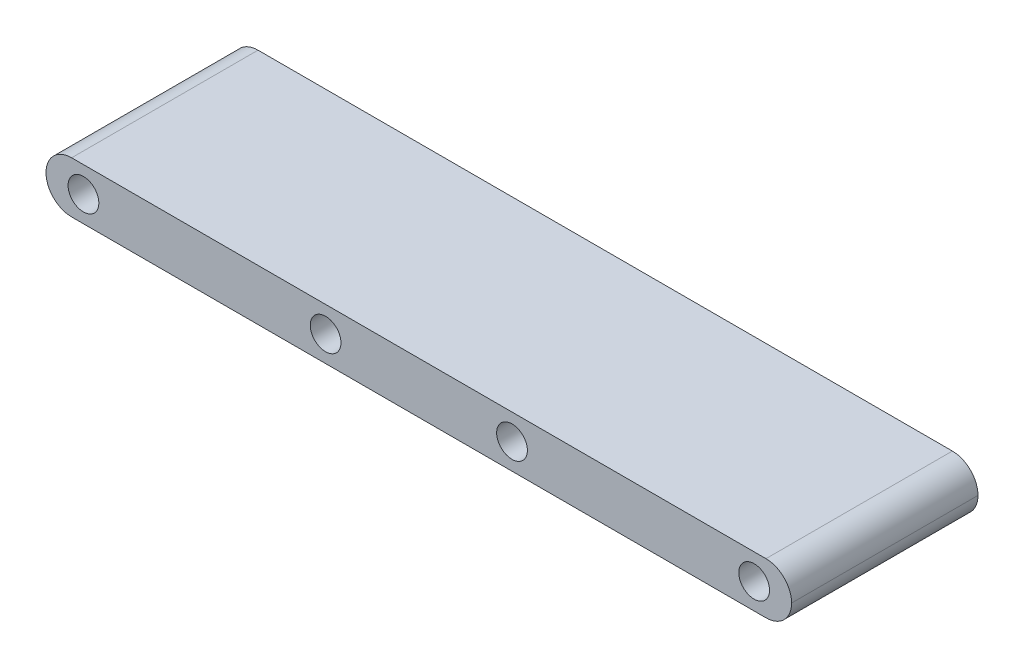
ISO-10303-21;
HEADER;
FILE_DESCRIPTION(('STEP AP214'),'2;1');
FILE_NAME('part.step','',(''),(''),'','','');
FILE_SCHEMA(('AUTOMOTIVE_DESIGN { 1 0 10303 214 1 1 1 1 }'));
ENDSEC;
DATA;
#1=APPLICATION_CONTEXT('core data for automotive mechanical design processes');
#2=APPLICATION_PROTOCOL_DEFINITION('international standard','automotive_design',2000,#1);
#3=PRODUCT_CONTEXT('',#1,'mechanical');
#4=PRODUCT('Part','Part','',(#3));
#5=PRODUCT_RELATED_PRODUCT_CATEGORY('part','',(#4));
#6=PRODUCT_DEFINITION_FORMATION('','',#4);
#7=PRODUCT_DEFINITION_CONTEXT('part definition',#1,'design');
#8=PRODUCT_DEFINITION('design','',#6,#7);
#9=PRODUCT_DEFINITION_SHAPE('','',#8);
#10=(LENGTH_UNIT() NAMED_UNIT(*) SI_UNIT(.MILLI.,.METRE.));
#11=(NAMED_UNIT(*) PLANE_ANGLE_UNIT() SI_UNIT($,.RADIAN.));
#12=(NAMED_UNIT(*) SI_UNIT($,.STERADIAN.) SOLID_ANGLE_UNIT());
#13=UNCERTAINTY_MEASURE_WITH_UNIT(LENGTH_MEASURE(1.E-05),#10,'distance_accuracy_value','');
#14=(GEOMETRIC_REPRESENTATION_CONTEXT(3) GLOBAL_UNCERTAINTY_ASSIGNED_CONTEXT((#13)) GLOBAL_UNIT_ASSIGNED_CONTEXT((#10,
#11,#12)) REPRESENTATION_CONTEXT('',''));
#15=CARTESIAN_POINT('',(0.,0.,0.));
#16=DIRECTION('',(0.,0.,1.));
#17=DIRECTION('',(1.,0.,0.));
#18=AXIS2_PLACEMENT_3D('',#15,#16,#17);
#19=CARTESIAN_POINT('',(0.,0.,200.));
#20=DIRECTION('',(0.,0.,-1.));
#21=DIRECTION('',(-1.,0.,0.));
#22=AXIS2_PLACEMENT_3D('',#19,#20,#21);
#23=PLANE('',#22);
#24=CARTESIAN_POINT('',(759.80762113533,27.5,200.));
#25=DIRECTION('',(0.,0.,1.));
#26=DIRECTION('',(1.,0.,0.));
#27=AXIS2_PLACEMENT_3D('',#24,#25,#26);
#28=CIRCLE('',#27,16.5);
#29=CARTESIAN_POINT('',(776.30762113533,27.5,200.));
#30=VERTEX_POINT('',#29);
#31=EDGE_CURVE('E198',#30,#30,#28,.T.);
#32=ORIENTED_EDGE('',*,*,#31,.F.);
#33=EDGE_LOOP('',(#32));
#34=FACE_BOUND('',#33,.T.);
#35=CARTESIAN_POINT('',(40.1923788646686,27.5,200.));
#36=DIRECTION('',(0.,0.,1.));
#37=DIRECTION('',(1.,0.,0.));
#38=AXIS2_PLACEMENT_3D('',#35,#36,#37);
#39=CIRCLE('',#38,16.5);
#40=CARTESIAN_POINT('',(56.6923788646686,27.5,200.));
#41=VERTEX_POINT('',#40);
#42=EDGE_CURVE('E161',#41,#41,#39,.T.);
#43=ORIENTED_EDGE('',*,*,#42,.F.);
#44=EDGE_LOOP('',(#43));
#45=FACE_BOUND('',#44,.T.);
#46=CARTESIAN_POINT('',(27.5,27.5,200.));
#47=DIRECTION('',(0.,0.,-1.));
#48=DIRECTION('',(-1.,0.,0.));
#49=AXIS2_PLACEMENT_3D('',#46,#47,#48);
#50=CIRCLE('',#49,27.5);
#51=CARTESIAN_POINT('',(27.5,55.,200.));
#52=VERTEX_POINT('',#51);
#53=CARTESIAN_POINT('',(0.,27.5,200.));
#54=VERTEX_POINT('',#53);
#55=EDGE_CURVE('E153',#52,#54,#50,.F.);
#56=ORIENTED_EDGE('',*,*,#55,.T.);
#57=CARTESIAN_POINT('',(27.5,27.5,200.));
#58=DIRECTION('',(0.,0.,-1.));
#59=DIRECTION('',(-1.,0.,0.));
#60=AXIS2_PLACEMENT_3D('',#57,#58,#59);
#61=CIRCLE('',#60,27.5);
#62=CARTESIAN_POINT('',(27.5,0.,200.));
#63=VERTEX_POINT('',#62);
#64=EDGE_CURVE('E156',#54,#63,#61,.F.);
#65=ORIENTED_EDGE('',*,*,#64,.T.);
#66=DIRECTION('',(1.,0.,0.));
#67=VECTOR('',#66,1.);
#68=CARTESIAN_POINT('',(0.,0.,200.));
#69=LINE('',#68,#67);
#70=CARTESIAN_POINT('',(772.5,0.,200.));
#71=VERTEX_POINT('',#70);
#72=EDGE_CURVE('E117',#63,#71,#69,.T.);
#73=ORIENTED_EDGE('',*,*,#72,.T.);
#74=CARTESIAN_POINT('',(772.5,27.5,200.));
#75=DIRECTION('',(0.,0.,-1.));
#76=DIRECTION('',(-1.,0.,0.));
#77=AXIS2_PLACEMENT_3D('',#74,#75,#76);
#78=CIRCLE('',#77,27.5);
#79=CARTESIAN_POINT('',(800.,27.5,200.));
#80=VERTEX_POINT('',#79);
#81=EDGE_CURVE('E150',#71,#80,#78,.F.);
#82=ORIENTED_EDGE('',*,*,#81,.T.);
#83=CARTESIAN_POINT('',(772.5,27.5,200.));
#84=DIRECTION('',(0.,0.,-1.));
#85=DIRECTION('',(-1.,0.,0.));
#86=AXIS2_PLACEMENT_3D('',#83,#84,#85);
#87=CIRCLE('',#86,27.5);
#88=CARTESIAN_POINT('',(772.5,55.,200.));
#89=VERTEX_POINT('',#88);
#90=EDGE_CURVE('E64',#80,#89,#87,.F.);
#91=ORIENTED_EDGE('',*,*,#90,.T.);
#92=DIRECTION('',(-1.,0.,0.));
#93=VECTOR('',#92,1.);
#94=CARTESIAN_POINT('',(0.,55.,200.));
#95=LINE('',#94,#93);
#96=EDGE_CURVE('E137',#89,#52,#95,.T.);
#97=ORIENTED_EDGE('',*,*,#96,.T.);
#98=EDGE_LOOP('',(#56,#65,#73,#82,#91,#97));
#99=FACE_BOUND('',#98,.T.);
#100=CARTESIAN_POINT('',(300.,27.5,200.));
#101=DIRECTION('',(0.,0.,1.));
#102=DIRECTION('',(1.,0.,0.));
#103=AXIS2_PLACEMENT_3D('',#100,#101,#102);
#104=CIRCLE('',#103,16.5);
#105=CARTESIAN_POINT('',(316.5,27.5,200.));
#106=VERTEX_POINT('',#105);
#107=EDGE_CURVE('E128',#106,#106,#104,.T.);
#108=ORIENTED_EDGE('',*,*,#107,.F.);
#109=EDGE_LOOP('',(#108));
#110=FACE_BOUND('',#109,.T.);
#111=CARTESIAN_POINT('',(500.,27.5,200.));
#112=DIRECTION('',(0.,0.,1.));
#113=DIRECTION('',(1.,0.,0.));
#114=AXIS2_PLACEMENT_3D('',#111,#112,#113);
#115=CIRCLE('',#114,16.5);
#116=CARTESIAN_POINT('',(516.5,27.5,200.));
#117=VERTEX_POINT('',#116);
#118=EDGE_CURVE('E185',#117,#117,#115,.T.);
#119=ORIENTED_EDGE('',*,*,#118,.F.);
#120=EDGE_LOOP('',(#119));
#121=FACE_BOUND('',#120,.T.);
#122=ADVANCED_FACE('F41',(#34,#45,#99,#110,#121),#23,.F.);
#123=CARTESIAN_POINT('',(0.,0.,0.));
#124=DIRECTION('',(0.,0.,-1.));
#125=DIRECTION('',(-1.,0.,0.));
#126=AXIS2_PLACEMENT_3D('',#123,#124,#125);
#127=PLANE('',#126);
#128=CARTESIAN_POINT('',(759.80762113533,27.5,0.));
#129=DIRECTION('',(0.,0.,1.));
#130=DIRECTION('',(1.,0.,0.));
#131=AXIS2_PLACEMENT_3D('',#128,#129,#130);
#132=CIRCLE('',#131,16.5);
#133=CARTESIAN_POINT('',(776.30762113533,27.5,0.));
#134=VERTEX_POINT('',#133);
#135=EDGE_CURVE('E191',#134,#134,#132,.T.);
#136=ORIENTED_EDGE('',*,*,#135,.T.);
#137=EDGE_LOOP('',(#136));
#138=FACE_BOUND('',#137,.T.);
#139=CARTESIAN_POINT('',(40.1923788646686,27.5,0.));
#140=DIRECTION('',(0.,0.,1.));
#141=DIRECTION('',(1.,0.,0.));
#142=AXIS2_PLACEMENT_3D('',#139,#140,#141);
#143=CIRCLE('',#142,16.5);
#144=CARTESIAN_POINT('',(56.6923788646686,27.5,0.));
#145=VERTEX_POINT('',#144);
#146=EDGE_CURVE('E165',#145,#145,#143,.T.);
#147=ORIENTED_EDGE('',*,*,#146,.T.);
#148=EDGE_LOOP('',(#147));
#149=FACE_BOUND('',#148,.T.);
#150=CARTESIAN_POINT('',(300.,27.5,0.));
#151=DIRECTION('',(0.,0.,1.));
#152=DIRECTION('',(1.,0.,0.));
#153=AXIS2_PLACEMENT_3D('',#150,#151,#152);
#154=CIRCLE('',#153,16.5);
#155=CARTESIAN_POINT('',(316.5,27.5,0.));
#156=VERTEX_POINT('',#155);
#157=EDGE_CURVE('E134',#156,#156,#154,.T.);
#158=ORIENTED_EDGE('',*,*,#157,.T.);
#159=EDGE_LOOP('',(#158));
#160=FACE_BOUND('',#159,.T.);
#161=DIRECTION('',(1.,0.,0.));
#162=VECTOR('',#161,1.);
#163=CARTESIAN_POINT('',(0.,0.,0.));
#164=LINE('',#163,#162);
#165=CARTESIAN_POINT('',(27.5,0.,0.));
#166=VERTEX_POINT('',#165);
#167=CARTESIAN_POINT('',(772.5,0.,0.));
#168=VERTEX_POINT('',#167);
#169=EDGE_CURVE('E114',#166,#168,#164,.T.);
#170=ORIENTED_EDGE('',*,*,#169,.F.);
#171=CARTESIAN_POINT('',(27.5,27.5,0.));
#172=DIRECTION('',(0.,0.,-1.));
#173=DIRECTION('',(-1.,0.,0.));
#174=AXIS2_PLACEMENT_3D('',#171,#172,#173);
#175=CIRCLE('',#174,27.5);
#176=CARTESIAN_POINT('',(0.,27.5,0.));
#177=VERTEX_POINT('',#176);
#178=EDGE_CURVE('E96',#166,#177,#175,.T.);
#179=ORIENTED_EDGE('',*,*,#178,.T.);
#180=CARTESIAN_POINT('',(27.5,27.5,0.));
#181=DIRECTION('',(0.,0.,-1.));
#182=DIRECTION('',(-1.,0.,0.));
#183=AXIS2_PLACEMENT_3D('',#180,#181,#182);
#184=CIRCLE('',#183,27.5);
#185=CARTESIAN_POINT('',(27.5,55.,0.));
#186=VERTEX_POINT('',#185);
#187=EDGE_CURVE('E107',#177,#186,#184,.T.);
#188=ORIENTED_EDGE('',*,*,#187,.T.);
#189=DIRECTION('',(-1.,0.,0.));
#190=VECTOR('',#189,1.);
#191=CARTESIAN_POINT('',(0.,55.,0.));
#192=LINE('',#191,#190);
#193=CARTESIAN_POINT('',(772.5,55.,0.));
#194=VERTEX_POINT('',#193);
#195=EDGE_CURVE('E127',#194,#186,#192,.T.);
#196=ORIENTED_EDGE('',*,*,#195,.F.);
#197=CARTESIAN_POINT('',(772.5,27.5,0.));
#198=DIRECTION('',(0.,0.,-1.));
#199=DIRECTION('',(-1.,0.,0.));
#200=AXIS2_PLACEMENT_3D('',#197,#198,#199);
#201=CIRCLE('',#200,27.5);
#202=CARTESIAN_POINT('',(800.,27.5,0.));
#203=VERTEX_POINT('',#202);
#204=EDGE_CURVE('E119',#194,#203,#201,.T.);
#205=ORIENTED_EDGE('',*,*,#204,.T.);
#206=CARTESIAN_POINT('',(772.5,27.5,0.));
#207=DIRECTION('',(0.,0.,-1.));
#208=DIRECTION('',(-1.,0.,0.));
#209=AXIS2_PLACEMENT_3D('',#206,#207,#208);
#210=CIRCLE('',#209,27.5);
#211=EDGE_CURVE('E125',#203,#168,#210,.T.);
#212=ORIENTED_EDGE('',*,*,#211,.T.);
#213=EDGE_LOOP('',(#170,#179,#188,#196,#205,#212));
#214=FACE_BOUND('',#213,.T.);
#215=CARTESIAN_POINT('',(500.,27.5,0.));
#216=DIRECTION('',(0.,0.,1.));
#217=DIRECTION('',(1.,0.,0.));
#218=AXIS2_PLACEMENT_3D('',#215,#216,#217);
#219=CIRCLE('',#218,16.5);
#220=CARTESIAN_POINT('',(516.5,27.5,0.));
#221=VERTEX_POINT('',#220);
#222=EDGE_CURVE('E187',#221,#221,#219,.T.);
#223=ORIENTED_EDGE('',*,*,#222,.T.);
#224=EDGE_LOOP('',(#223));
#225=FACE_BOUND('',#224,.T.);
#226=ADVANCED_FACE('F122',(#138,#149,#160,#214,#225),#127,.T.);
#227=CARTESIAN_POINT('',(0.,0.,200.));
#228=DIRECTION('',(0.,1.,0.));
#229=DIRECTION('',(0.,0.,1.));
#230=AXIS2_PLACEMENT_3D('',#227,#228,#229);
#231=PLANE('',#230);
#232=ORIENTED_EDGE('',*,*,#72,.F.);
#233=DIRECTION('',(0.,0.,-1.));
#234=VECTOR('',#233,1.);
#235=CARTESIAN_POINT('',(27.5,0.,200.));
#236=LINE('',#235,#234);
#237=EDGE_CURVE('E100',#63,#166,#236,.T.);
#238=ORIENTED_EDGE('',*,*,#237,.T.);
#239=ORIENTED_EDGE('',*,*,#169,.T.);
#240=DIRECTION('',(0.,0.,-1.));
#241=VECTOR('',#240,1.);
#242=CARTESIAN_POINT('',(772.5,0.,200.));
#243=LINE('',#242,#241);
#244=EDGE_CURVE('E120',#168,#71,#243,.F.);
#245=ORIENTED_EDGE('',*,*,#244,.T.);
#246=EDGE_LOOP('',(#232,#238,#239,#245));
#247=FACE_BOUND('',#246,.T.);
#248=ADVANCED_FACE('F112',(#247),#231,.F.);
#249=CARTESIAN_POINT('',(0.,55.,200.));
#250=DIRECTION('',(0.,-1.,0.));
#251=DIRECTION('',(0.,0.,-1.));
#252=AXIS2_PLACEMENT_3D('',#249,#250,#251);
#253=PLANE('',#252);
#254=ORIENTED_EDGE('',*,*,#195,.T.);
#255=DIRECTION('',(0.,0.,-1.));
#256=VECTOR('',#255,1.);
#257=CARTESIAN_POINT('',(27.5,55.,200.));
#258=LINE('',#257,#256);
#259=EDGE_CURVE('E11',#186,#52,#258,.F.);
#260=ORIENTED_EDGE('',*,*,#259,.T.);
#261=ORIENTED_EDGE('',*,*,#96,.F.);
#262=DIRECTION('',(0.,0.,-1.));
#263=VECTOR('',#262,1.);
#264=CARTESIAN_POINT('',(772.5,55.,200.));
#265=LINE('',#264,#263);
#266=EDGE_CURVE('E51',#89,#194,#265,.T.);
#267=ORIENTED_EDGE('',*,*,#266,.T.);
#268=EDGE_LOOP('',(#254,#260,#261,#267));
#269=FACE_BOUND('',#268,.T.);
#270=ADVANCED_FACE('F175',(#269),#253,.F.);
#271=CARTESIAN_POINT('',(300.,27.5,200.));
#272=DIRECTION('',(0.,0.,-1.));
#273=DIRECTION('',(-1.,0.,0.));
#274=AXIS2_PLACEMENT_3D('',#271,#272,#273);
#275=CYLINDRICAL_SURFACE('',#274,16.5);
#276=ORIENTED_EDGE('',*,*,#107,.T.);
#277=EDGE_LOOP('',(#276));
#278=FACE_BOUND('',#277,.T.);
#279=ORIENTED_EDGE('',*,*,#157,.F.);
#280=EDGE_LOOP('',(#279));
#281=FACE_BOUND('',#280,.T.);
#282=ADVANCED_FACE('F227',(#278,#281),#275,.F.);
#283=CARTESIAN_POINT('',(500.,27.5,200.));
#284=DIRECTION('',(0.,0.,-1.));
#285=DIRECTION('',(-1.,0.,0.));
#286=AXIS2_PLACEMENT_3D('',#283,#284,#285);
#287=CYLINDRICAL_SURFACE('',#286,16.5);
#288=ORIENTED_EDGE('',*,*,#118,.T.);
#289=EDGE_LOOP('',(#288));
#290=FACE_BOUND('',#289,.T.);
#291=ORIENTED_EDGE('',*,*,#222,.F.);
#292=EDGE_LOOP('',(#291));
#293=FACE_BOUND('',#292,.T.);
#294=ADVANCED_FACE('F221',(#290,#293),#287,.F.);
#295=CARTESIAN_POINT('',(40.1923788646686,27.5,0.));
#296=DIRECTION('',(0.,0.,1.));
#297=DIRECTION('',(1.,0.,0.));
#298=AXIS2_PLACEMENT_3D('',#295,#296,#297);
#299=CYLINDRICAL_SURFACE('',#298,16.5);
#300=ORIENTED_EDGE('',*,*,#146,.F.);
#301=EDGE_LOOP('',(#300));
#302=FACE_BOUND('',#301,.T.);
#303=ORIENTED_EDGE('',*,*,#42,.T.);
#304=EDGE_LOOP('',(#303));
#305=FACE_BOUND('',#304,.T.);
#306=ADVANCED_FACE('F211',(#302,#305),#299,.F.);
#307=CARTESIAN_POINT('',(759.80762113533,27.5,0.));
#308=DIRECTION('',(0.,0.,1.));
#309=DIRECTION('',(1.,0.,0.));
#310=AXIS2_PLACEMENT_3D('',#307,#308,#309);
#311=CYLINDRICAL_SURFACE('',#310,16.5);
#312=ORIENTED_EDGE('',*,*,#135,.F.);
#313=EDGE_LOOP('',(#312));
#314=FACE_BOUND('',#313,.T.);
#315=ORIENTED_EDGE('',*,*,#31,.T.);
#316=EDGE_LOOP('',(#315));
#317=FACE_BOUND('',#316,.T.);
#318=ADVANCED_FACE('F208',(#314,#317),#311,.F.);
#319=CARTESIAN_POINT('',(27.5,27.5,200.));
#320=DIRECTION('',(0.,0.,-1.));
#321=DIRECTION('',(-1.,0.,0.));
#322=AXIS2_PLACEMENT_3D('',#319,#320,#321);
#323=CYLINDRICAL_SURFACE('',#322,27.5);
#324=DIRECTION('',(0.,0.,-1.));
#325=VECTOR('',#324,1.);
#326=CARTESIAN_POINT('',(0.,27.5,200.));
#327=LINE('',#326,#325);
#328=EDGE_CURVE('E102',#54,#177,#327,.T.);
#329=ORIENTED_EDGE('',*,*,#328,.F.);
#330=ORIENTED_EDGE('',*,*,#55,.F.);
#331=ORIENTED_EDGE('',*,*,#259,.F.);
#332=ORIENTED_EDGE('',*,*,#187,.F.);
#333=EDGE_LOOP('',(#329,#330,#331,#332));
#334=FACE_BOUND('',#333,.T.);
#335=ADVANCED_FACE('F177',(#334),#323,.T.);
#336=CARTESIAN_POINT('',(27.5,27.5,200.));
#337=DIRECTION('',(0.,0.,-1.));
#338=DIRECTION('',(-1.,0.,0.));
#339=AXIS2_PLACEMENT_3D('',#336,#337,#338);
#340=CYLINDRICAL_SURFACE('',#339,27.5);
#341=ORIENTED_EDGE('',*,*,#64,.F.);
#342=ORIENTED_EDGE('',*,*,#328,.T.);
#343=ORIENTED_EDGE('',*,*,#178,.F.);
#344=ORIENTED_EDGE('',*,*,#237,.F.);
#345=EDGE_LOOP('',(#341,#342,#343,#344));
#346=FACE_BOUND('',#345,.T.);
#347=ADVANCED_FACE('F99',(#346),#340,.T.);
#348=CARTESIAN_POINT('',(772.5,27.5,200.));
#349=DIRECTION('',(0.,0.,-1.));
#350=DIRECTION('',(-1.,0.,0.));
#351=AXIS2_PLACEMENT_3D('',#348,#349,#350);
#352=CYLINDRICAL_SURFACE('',#351,27.5);
#353=ORIENTED_EDGE('',*,*,#266,.F.);
#354=ORIENTED_EDGE('',*,*,#90,.F.);
#355=DIRECTION('',(0.,0.,-1.));
#356=VECTOR('',#355,1.);
#357=CARTESIAN_POINT('',(800.,27.5,200.));
#358=LINE('',#357,#356);
#359=EDGE_CURVE('E45',#203,#80,#358,.F.);
#360=ORIENTED_EDGE('',*,*,#359,.F.);
#361=ORIENTED_EDGE('',*,*,#204,.F.);
#362=EDGE_LOOP('',(#353,#354,#360,#361));
#363=FACE_BOUND('',#362,.T.);
#364=ADVANCED_FACE('F43',(#363),#352,.T.);
#365=CARTESIAN_POINT('',(772.5,27.5,200.));
#366=DIRECTION('',(0.,0.,-1.));
#367=DIRECTION('',(-1.,0.,0.));
#368=AXIS2_PLACEMENT_3D('',#365,#366,#367);
#369=CYLINDRICAL_SURFACE('',#368,27.5);
#370=ORIENTED_EDGE('',*,*,#81,.F.);
#371=ORIENTED_EDGE('',*,*,#244,.F.);
#372=ORIENTED_EDGE('',*,*,#211,.F.);
#373=ORIENTED_EDGE('',*,*,#359,.T.);
#374=EDGE_LOOP('',(#370,#371,#372,#373));
#375=FACE_BOUND('',#374,.T.);
#376=ADVANCED_FACE('F170',(#375),#369,.T.);
#377=CLOSED_SHELL('',(#122,#226,#248,#270,#282,#294,#306,#318,#335,#347,#364,#376));
#378=MANIFOLD_SOLID_BREP('B2',#377);
#379=ADVANCED_BREP_SHAPE_REPRESENTATION('',(#18,#378),#14);
#380=SHAPE_DEFINITION_REPRESENTATION(#9,#379);
ENDSEC;
END-ISO-10303-21;
